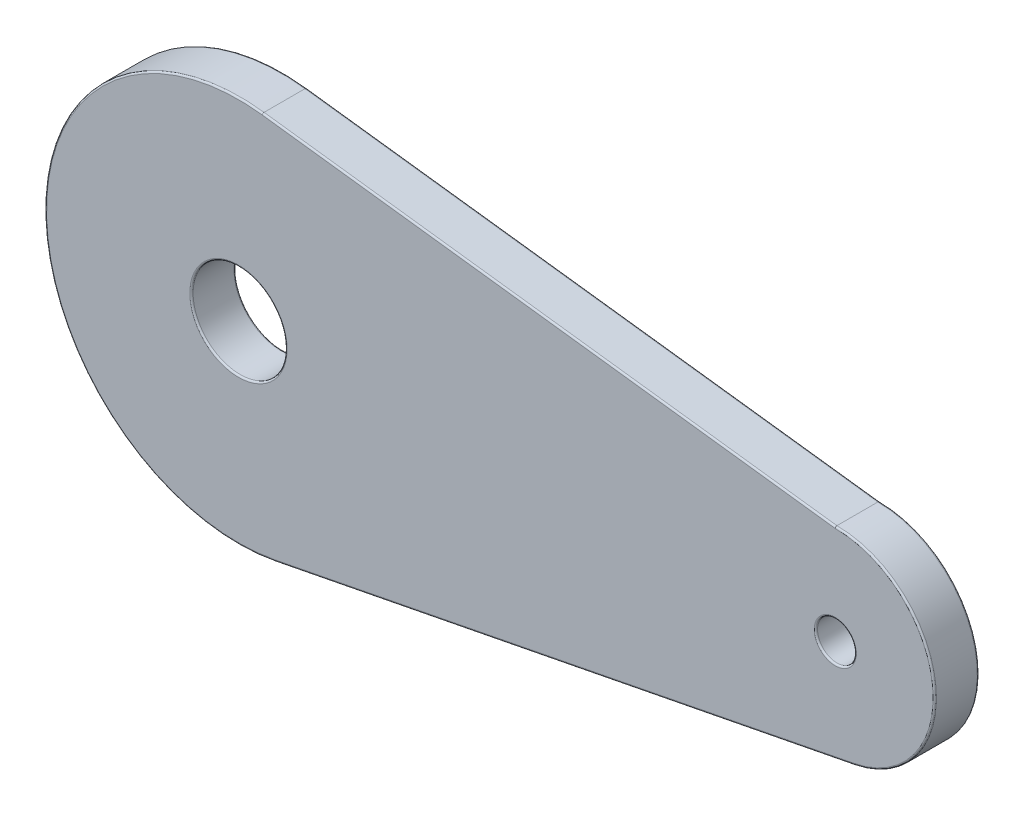
ISO-10303-21;
HEADER;
FILE_DESCRIPTION(('STEP AP214'),'2;1');
FILE_NAME('part.step','',(''),(''),'','','');
FILE_SCHEMA(('AUTOMOTIVE_DESIGN { 1 0 10303 214 1 1 1 1 }'));
ENDSEC;
DATA;
#1=APPLICATION_CONTEXT('core data for automotive mechanical design processes');
#2=APPLICATION_PROTOCOL_DEFINITION('international standard','automotive_design',2000,#1);
#3=PRODUCT_CONTEXT('',#1,'mechanical');
#4=PRODUCT('Part','Part','',(#3));
#5=PRODUCT_RELATED_PRODUCT_CATEGORY('part','',(#4));
#6=PRODUCT_DEFINITION_FORMATION('','',#4);
#7=PRODUCT_DEFINITION_CONTEXT('part definition',#1,'design');
#8=PRODUCT_DEFINITION('design','',#6,#7);
#9=PRODUCT_DEFINITION_SHAPE('','',#8);
#10=(LENGTH_UNIT() NAMED_UNIT(*) SI_UNIT(.MILLI.,.METRE.));
#11=(NAMED_UNIT(*) PLANE_ANGLE_UNIT() SI_UNIT($,.RADIAN.));
#12=(NAMED_UNIT(*) SI_UNIT($,.STERADIAN.) SOLID_ANGLE_UNIT());
#13=UNCERTAINTY_MEASURE_WITH_UNIT(LENGTH_MEASURE(1.E-05),#10,'distance_accuracy_value','');
#14=(GEOMETRIC_REPRESENTATION_CONTEXT(3) GLOBAL_UNCERTAINTY_ASSIGNED_CONTEXT((#13)) GLOBAL_UNIT_ASSIGNED_CONTEXT((#10,
#11,#12)) REPRESENTATION_CONTEXT('',''));
#15=CARTESIAN_POINT('',(0.,0.,0.));
#16=DIRECTION('',(0.,0.,1.));
#17=DIRECTION('',(1.,0.,0.));
#18=AXIS2_PLACEMENT_3D('',#15,#16,#17);
#19=CARTESIAN_POINT('',(-20.22,57.58,-4.));
#20=DIRECTION('',(0.,0.,1.));
#21=DIRECTION('',(1.,0.,0.));
#22=AXIS2_PLACEMENT_3D('',#19,#20,#21);
#23=CYLINDRICAL_SURFACE('',#22,17.5);
#24=DIRECTION('',(0.,0.,1.));
#25=VECTOR('',#24,1.);
#26=CARTESIAN_POINT('',(-18.0510945674369,74.9450755605784,-4.));
#27=LINE('',#26,#25);
#28=CARTESIAN_POINT('',(-18.0510945674369,74.9450755605784,-3.85));
#29=VERTEX_POINT('',#28);
#30=CARTESIAN_POINT('',(-18.0510945674369,74.9450755605784,-0.15));
#31=VERTEX_POINT('',#30);
#32=EDGE_CURVE('E104',#29,#31,#27,.T.);
#33=ORIENTED_EDGE('',*,*,#32,.F.);
#34=CARTESIAN_POINT('',(-20.22,57.58,-3.85));
#35=DIRECTION('',(0.,0.,1.));
#36=DIRECTION('',(1.,0.,0.));
#37=AXIS2_PLACEMENT_3D('',#34,#35,#36);
#38=CIRCLE('',#37,17.5);
#39=CARTESIAN_POINT('',(-16.8604414366495,40.405502445212,-3.85));
#40=VERTEX_POINT('',#39);
#41=EDGE_CURVE('E99',#29,#40,#38,.T.);
#42=ORIENTED_EDGE('',*,*,#41,.T.);
#43=DIRECTION('',(0.,0.,1.));
#44=VECTOR('',#43,1.);
#45=CARTESIAN_POINT('',(-16.8604414366495,40.405502445212,-4.));
#46=LINE('',#45,#44);
#47=CARTESIAN_POINT('',(-16.8604414366495,40.405502445212,-0.15));
#48=VERTEX_POINT('',#47);
#49=EDGE_CURVE('E101',#40,#48,#46,.T.);
#50=ORIENTED_EDGE('',*,*,#49,.T.);
#51=CARTESIAN_POINT('',(-20.22,57.58,-0.15));
#52=DIRECTION('',(0.,0.,1.));
#53=DIRECTION('',(1.,0.,0.));
#54=AXIS2_PLACEMENT_3D('',#51,#52,#53);
#55=CIRCLE('',#54,17.5);
#56=EDGE_CURVE('E110',#48,#31,#55,.F.);
#57=ORIENTED_EDGE('',*,*,#56,.T.);
#58=EDGE_LOOP('',(#33,#42,#50,#57));
#59=FACE_BOUND('',#58,.T.);
#60=ADVANCED_FACE('F33',(#59),#23,.T.);
#61=CARTESIAN_POINT('',(-18.0510945674369,74.9450755605784,-4.));
#62=DIRECTION('',(0.123937453289322,0.992290032033053,0.));
#63=DIRECTION('',(-0.992290032033053,0.123937453289322,0.));
#64=AXIS2_PLACEMENT_3D('',#61,#62,#63);
#65=PLANE('',#64);
#66=DIRECTION('',(0.,0.,1.));
#67=VECTOR('',#66,1.);
#68=CARTESIAN_POINT('',(33.7467217571438,68.4755059448647,-4.));
#69=LINE('',#68,#67);
#70=CARTESIAN_POINT('',(33.7467217571438,68.4755059448647,-3.85));
#71=VERTEX_POINT('',#70);
#72=CARTESIAN_POINT('',(33.7467217571438,68.4755059448647,-0.15));
#73=VERTEX_POINT('',#72);
#74=EDGE_CURVE('E247',#71,#73,#69,.T.);
#75=ORIENTED_EDGE('',*,*,#74,.F.);
#76=DIRECTION('',(-0.992290032033053,0.123937453289322,0.));
#77=VECTOR('',#76,1.);
#78=CARTESIAN_POINT('',(-18.0510945674369,74.9450755605784,-3.85));
#79=LINE('',#78,#77);
#80=EDGE_CURVE('E160',#71,#29,#79,.T.);
#81=ORIENTED_EDGE('',*,*,#80,.T.);
#82=ORIENTED_EDGE('',*,*,#32,.T.);
#83=DIRECTION('',(-0.992290032033053,0.123937453289322,0.));
#84=VECTOR('',#83,1.);
#85=CARTESIAN_POINT('',(-18.0510945674369,74.9450755605784,-0.15));
#86=LINE('',#85,#84);
#87=EDGE_CURVE('E157',#31,#73,#86,.F.);
#88=ORIENTED_EDGE('',*,*,#87,.T.);
#89=EDGE_LOOP('',(#75,#81,#82,#88));
#90=FACE_BOUND('',#89,.T.);
#91=ADVANCED_FACE('F244',(#90),#65,.T.);
#92=CARTESIAN_POINT('',(33.7467217571438,59.4755059448647,-4.));
#93=DIRECTION('',(0.,0.,1.));
#94=DIRECTION('',(1.,0.,0.));
#95=AXIS2_PLACEMENT_3D('',#92,#93,#94);
#96=CYLINDRICAL_SURFACE('',#95,9.);
#97=DIRECTION('',(0.,0.,1.));
#98=VECTOR('',#97,1.);
#99=CARTESIAN_POINT('',(35.4744947325812,50.6429072024023,-4.));
#100=LINE('',#99,#98);
#101=CARTESIAN_POINT('',(35.4744947325812,50.6429072024023,-3.85));
#102=VERTEX_POINT('',#101);
#103=CARTESIAN_POINT('',(35.4744947325812,50.6429072024023,-0.15));
#104=VERTEX_POINT('',#103);
#105=EDGE_CURVE('E121',#102,#104,#100,.T.);
#106=ORIENTED_EDGE('',*,*,#105,.F.);
#107=CARTESIAN_POINT('',(33.7467217571438,59.4755059448647,-3.85));
#108=DIRECTION('',(0.,0.,1.));
#109=DIRECTION('',(1.,0.,0.));
#110=AXIS2_PLACEMENT_3D('',#107,#108,#109);
#111=CIRCLE('',#110,9.);
#112=EDGE_CURVE('E155',#102,#71,#111,.T.);
#113=ORIENTED_EDGE('',*,*,#112,.T.);
#114=ORIENTED_EDGE('',*,*,#74,.T.);
#115=CARTESIAN_POINT('',(33.7467217571438,59.4755059448647,-0.15));
#116=DIRECTION('',(0.,0.,1.));
#117=DIRECTION('',(1.,0.,0.));
#118=AXIS2_PLACEMENT_3D('',#115,#116,#117);
#119=CIRCLE('',#118,9.);
#120=EDGE_CURVE('E153',#73,#104,#119,.F.);
#121=ORIENTED_EDGE('',*,*,#120,.T.);
#122=EDGE_LOOP('',(#106,#113,#114,#121));
#123=FACE_BOUND('',#122,.T.);
#124=ADVANCED_FACE('F277',(#123),#96,.T.);
#125=CARTESIAN_POINT('',(-16.8604414366495,40.405502445212,-4.));
#126=DIRECTION('',(0.191974775048599,-0.981399860273599,0.));
#127=DIRECTION('',(0.981399860273599,0.191974775048599,0.));
#128=AXIS2_PLACEMENT_3D('',#125,#126,#127);
#129=PLANE('',#128);
#130=ORIENTED_EDGE('',*,*,#49,.F.);
#131=DIRECTION('',(0.981399860273599,0.191974775048599,0.));
#132=VECTOR('',#131,1.);
#133=CARTESIAN_POINT('',(35.4744947325813,50.6429072024024,-3.85));
#134=LINE('',#133,#132);
#135=EDGE_CURVE('E117',#40,#102,#134,.T.);
#136=ORIENTED_EDGE('',*,*,#135,.T.);
#137=ORIENTED_EDGE('',*,*,#105,.T.);
#138=DIRECTION('',(0.981399860273599,0.191974775048599,0.));
#139=VECTOR('',#138,1.);
#140=CARTESIAN_POINT('',(-16.8604414366495,40.405502445212,-0.15));
#141=LINE('',#140,#139);
#142=EDGE_CURVE('E120',#104,#48,#141,.F.);
#143=ORIENTED_EDGE('',*,*,#142,.T.);
#144=EDGE_LOOP('',(#130,#136,#137,#143));
#145=FACE_BOUND('',#144,.T.);
#146=ADVANCED_FACE('F114',(#145),#129,.T.);
#147=CARTESIAN_POINT('',(-20.22,57.58,-4.));
#148=DIRECTION('',(0.,0.,1.));
#149=DIRECTION('',(1.,0.,0.));
#150=AXIS2_PLACEMENT_3D('',#147,#148,#149);
#151=PLANE('',#150);
#152=CARTESIAN_POINT('',(33.7467217571438,59.4755059448647,-4.));
#153=DIRECTION('',(0.,0.,1.));
#154=DIRECTION('',(1.,0.,0.));
#155=AXIS2_PLACEMENT_3D('',#152,#153,#154);
#156=CIRCLE('',#155,8.85);
#157=CARTESIAN_POINT('',(33.7374295335089,68.3255010665911,-4.));
#158=VERTEX_POINT('',#157);
#159=CARTESIAN_POINT('',(35.445698516324,50.7901171814434,-4.));
#160=VERTEX_POINT('',#159);
#161=EDGE_CURVE('E149',#158,#160,#156,.F.);
#162=ORIENTED_EDGE('',*,*,#161,.T.);
#163=DIRECTION('',(0.981399860273599,0.191974775048599,0.));
#164=VECTOR('',#163,1.);
#165=CARTESIAN_POINT('',(-16.8892376529068,40.5527124242531,-4.));
#166=LINE('',#165,#164);
#167=CARTESIAN_POINT('',(-16.8892376529068,40.5527124242531,-4.));
#168=VERTEX_POINT('',#167);
#169=EDGE_CURVE('E151',#160,#168,#166,.F.);
#170=ORIENTED_EDGE('',*,*,#169,.T.);
#171=CARTESIAN_POINT('',(-20.22,57.58,-4.));
#172=DIRECTION('',(0.,0.,1.));
#173=DIRECTION('',(1.,0.,0.));
#174=AXIS2_PLACEMENT_3D('',#171,#172,#173);
#175=CIRCLE('',#174,17.35);
#176=CARTESIAN_POINT('',(-18.0696851854303,74.7962320557735,-4.));
#177=VERTEX_POINT('',#176);
#178=EDGE_CURVE('E127',#168,#177,#175,.F.);
#179=ORIENTED_EDGE('',*,*,#178,.T.);
#180=DIRECTION('',(-0.992290032033053,0.123937453289322,0.));
#181=VECTOR('',#180,1.);
#182=CARTESIAN_POINT('',(33.7281311391504,68.3266624400598,-4.));
#183=LINE('',#182,#181);
#184=EDGE_CURVE('E147',#177,#158,#183,.F.);
#185=ORIENTED_EDGE('',*,*,#184,.T.);
#186=EDGE_LOOP('',(#162,#170,#179,#185));
#187=FACE_BOUND('',#186,.T.);
#188=CARTESIAN_POINT('',(-20.22,57.58,-4.));
#189=DIRECTION('',(0.,0.,1.));
#190=DIRECTION('',(1.,0.,0.));
#191=AXIS2_PLACEMENT_3D('',#188,#189,#190);
#192=CIRCLE('',#191,4.4);
#193=CARTESIAN_POINT('',(-15.82,57.58,-4.));
#194=VERTEX_POINT('',#193);
#195=EDGE_CURVE('E140',#194,#194,#192,.T.);
#196=ORIENTED_EDGE('',*,*,#195,.T.);
#197=EDGE_LOOP('',(#196));
#198=FACE_BOUND('',#197,.T.);
#199=CARTESIAN_POINT('',(33.7467217571438,59.4755059448647,-4.));
#200=DIRECTION('',(0.,0.,1.));
#201=DIRECTION('',(1.,0.,0.));
#202=AXIS2_PLACEMENT_3D('',#199,#200,#201);
#203=CIRCLE('',#202,1.9);
#204=CARTESIAN_POINT('',(35.6467217571438,59.4755059448647,-4.));
#205=VERTEX_POINT('',#204);
#206=EDGE_CURVE('E137',#205,#205,#203,.T.);
#207=ORIENTED_EDGE('',*,*,#206,.T.);
#208=EDGE_LOOP('',(#207));
#209=FACE_BOUND('',#208,.T.);
#210=ADVANCED_FACE('F254',(#187,#198,#209),#151,.F.);
#211=CARTESIAN_POINT('',(-20.22,57.58,0.));
#212=DIRECTION('',(0.,0.,1.));
#213=DIRECTION('',(1.,0.,0.));
#214=AXIS2_PLACEMENT_3D('',#211,#212,#213);
#215=PLANE('',#214);
#216=CARTESIAN_POINT('',(33.7467217571438,59.4755059448647,0.));
#217=DIRECTION('',(0.,0.,1.));
#218=DIRECTION('',(1.,0.,0.));
#219=AXIS2_PLACEMENT_3D('',#216,#217,#218);
#220=CIRCLE('',#219,8.85);
#221=CARTESIAN_POINT('',(35.445698516324,50.7901171814434,0.));
#222=VERTEX_POINT('',#221);
#223=CARTESIAN_POINT('',(33.7374295335089,68.3255010665911,0.));
#224=VERTEX_POINT('',#223);
#225=EDGE_CURVE('E42',#222,#224,#220,.T.);
#226=ORIENTED_EDGE('',*,*,#225,.T.);
#227=DIRECTION('',(-0.992290032033053,0.123937453289322,0.));
#228=VECTOR('',#227,1.);
#229=CARTESIAN_POINT('',(-18.0696851854303,74.7962320557735,0.));
#230=LINE('',#229,#228);
#231=CARTESIAN_POINT('',(-18.0696851854303,74.7962320557735,0.));
#232=VERTEX_POINT('',#231);
#233=EDGE_CURVE('E11',#224,#232,#230,.T.);
#234=ORIENTED_EDGE('',*,*,#233,.T.);
#235=CARTESIAN_POINT('',(-20.22,57.58,0.));
#236=DIRECTION('',(0.,0.,1.));
#237=DIRECTION('',(1.,0.,0.));
#238=AXIS2_PLACEMENT_3D('',#235,#236,#237);
#239=CIRCLE('',#238,17.35);
#240=CARTESIAN_POINT('',(-16.8892376529068,40.5527124242531,0.));
#241=VERTEX_POINT('',#240);
#242=EDGE_CURVE('E180',#232,#241,#239,.T.);
#243=ORIENTED_EDGE('',*,*,#242,.T.);
#244=DIRECTION('',(0.981399860273599,0.191974775048599,0.));
#245=VECTOR('',#244,1.);
#246=CARTESIAN_POINT('',(-16.8892376529068,40.5527124242531,0.));
#247=LINE('',#246,#245);
#248=EDGE_CURVE('E53',#241,#222,#247,.T.);
#249=ORIENTED_EDGE('',*,*,#248,.T.);
#250=EDGE_LOOP('',(#226,#234,#243,#249));
#251=FACE_BOUND('',#250,.T.);
#252=CARTESIAN_POINT('',(-20.22,57.58,0.));
#253=DIRECTION('',(0.,0.,1.));
#254=DIRECTION('',(1.,0.,0.));
#255=AXIS2_PLACEMENT_3D('',#252,#253,#254);
#256=CIRCLE('',#255,4.4);
#257=CARTESIAN_POINT('',(-15.82,57.58,0.));
#258=VERTEX_POINT('',#257);
#259=EDGE_CURVE('E177',#258,#258,#256,.F.);
#260=ORIENTED_EDGE('',*,*,#259,.T.);
#261=EDGE_LOOP('',(#260));
#262=FACE_BOUND('',#261,.T.);
#263=CARTESIAN_POINT('',(33.7467217571438,59.4755059448647,0.));
#264=DIRECTION('',(0.,0.,1.));
#265=DIRECTION('',(1.,0.,0.));
#266=AXIS2_PLACEMENT_3D('',#263,#264,#265);
#267=CIRCLE('',#266,1.9);
#268=CARTESIAN_POINT('',(35.6467217571438,59.4755059448647,0.));
#269=VERTEX_POINT('',#268);
#270=EDGE_CURVE('E174',#269,#269,#267,.F.);
#271=ORIENTED_EDGE('',*,*,#270,.T.);
#272=EDGE_LOOP('',(#271));
#273=FACE_BOUND('',#272,.T.);
#274=ADVANCED_FACE('F250',(#251,#262,#273),#215,.T.);
#275=CARTESIAN_POINT('',(-20.22,57.58,-4.));
#276=DIRECTION('',(0.,0.,1.));
#277=DIRECTION('',(1.,0.,0.));
#278=AXIS2_PLACEMENT_3D('',#275,#276,#277);
#279=CYLINDRICAL_SURFACE('',#278,4.25);
#280=CARTESIAN_POINT('',(-20.22,57.58,-3.85));
#281=DIRECTION('',(0.,0.,1.));
#282=DIRECTION('',(1.,0.,0.));
#283=AXIS2_PLACEMENT_3D('',#280,#281,#282);
#284=CIRCLE('',#283,4.25);
#285=CARTESIAN_POINT('',(-15.97,57.58,-3.85));
#286=VERTEX_POINT('',#285);
#287=EDGE_CURVE('E165',#286,#286,#284,.F.);
#288=ORIENTED_EDGE('',*,*,#287,.T.);
#289=EDGE_LOOP('',(#288));
#290=FACE_BOUND('',#289,.T.);
#291=CARTESIAN_POINT('',(-20.22,57.58,-0.15));
#292=DIRECTION('',(0.,0.,1.));
#293=DIRECTION('',(1.,0.,0.));
#294=AXIS2_PLACEMENT_3D('',#291,#292,#293);
#295=CIRCLE('',#294,4.25);
#296=CARTESIAN_POINT('',(-15.97,57.58,-0.15));
#297=VERTEX_POINT('',#296);
#298=EDGE_CURVE('E109',#297,#297,#295,.T.);
#299=ORIENTED_EDGE('',*,*,#298,.T.);
#300=EDGE_LOOP('',(#299));
#301=FACE_BOUND('',#300,.T.);
#302=ADVANCED_FACE('F253',(#290,#301),#279,.F.);
#303=CARTESIAN_POINT('',(33.7467217571438,59.4755059448647,-4.));
#304=DIRECTION('',(0.,0.,1.));
#305=DIRECTION('',(1.,0.,0.));
#306=AXIS2_PLACEMENT_3D('',#303,#304,#305);
#307=CYLINDRICAL_SURFACE('',#306,1.75);
#308=CARTESIAN_POINT('',(33.7467217571438,59.4755059448647,-3.85));
#309=DIRECTION('',(0.,0.,1.));
#310=DIRECTION('',(1.,0.,0.));
#311=AXIS2_PLACEMENT_3D('',#308,#309,#310);
#312=CIRCLE('',#311,1.75);
#313=CARTESIAN_POINT('',(35.4967217571438,59.4755059448647,-3.85));
#314=VERTEX_POINT('',#313);
#315=EDGE_CURVE('E171',#314,#314,#312,.F.);
#316=ORIENTED_EDGE('',*,*,#315,.T.);
#317=EDGE_LOOP('',(#316));
#318=FACE_BOUND('',#317,.T.);
#319=CARTESIAN_POINT('',(33.7467217571438,59.4755059448647,-0.15));
#320=DIRECTION('',(0.,0.,1.));
#321=DIRECTION('',(1.,0.,0.));
#322=AXIS2_PLACEMENT_3D('',#319,#320,#321);
#323=CIRCLE('',#322,1.75);
#324=CARTESIAN_POINT('',(35.4967217571438,59.4755059448647,-0.15));
#325=VERTEX_POINT('',#324);
#326=EDGE_CURVE('E168',#325,#325,#323,.T.);
#327=ORIENTED_EDGE('',*,*,#326,.T.);
#328=EDGE_LOOP('',(#327));
#329=FACE_BOUND('',#328,.T.);
#330=ADVANCED_FACE('F201',(#318,#329),#307,.F.);
#331=CARTESIAN_POINT('',(-18.0696851854303,74.7962320557735,-3.85));
#332=DIRECTION('',(0.992290032033053,-0.123937453289322,0.));
#333=DIRECTION('',(0.123937453289322,0.992290032033053,0.));
#334=AXIS2_PLACEMENT_3D('',#331,#332,#333);
#335=CYLINDRICAL_SURFACE('',#334,0.15);
#336=CARTESIAN_POINT('',(33.7467217571438,68.4755059448647,-3.85));
#337=CARTESIAN_POINT('',(33.7467222168358,68.4755131656087,-3.85842659701889));
#338=CARTESIAN_POINT('',(33.7466776116465,68.4747963048347,-3.86685095839555));
#339=CARTESIAN_POINT('',(33.7465016638026,68.4719677037149,-3.88345494589551));
#340=CARTESIAN_POINT('',(33.746370387366,68.4698570282625,-3.8916347538778));
#341=CARTESIAN_POINT('',(33.746024399664,68.4642926428983,-3.90752662756495));
#342=CARTESIAN_POINT('',(33.7458096497533,68.4608383109193,-3.91523847470544));
#343=CARTESIAN_POINT('',(33.7453032126542,68.452688823793,-3.92997057043136));
#344=CARTESIAN_POINT('',(33.7450115439834,68.447993967291,-3.93699098491554));
#345=CARTESIAN_POINT('',(33.7443594566485,68.4374924415232,-3.95014929169074));
#346=CARTESIAN_POINT('',(33.7439989853661,68.4316849213103,-3.95628650219016));
#347=CARTESIAN_POINT('',(33.7432197112298,68.4191228659071,-3.96750171653171));
#348=CARTESIAN_POINT('',(33.742800883773,68.4123679312801,-3.97257927135741));
#349=CARTESIAN_POINT('',(33.7419161747661,68.3980899820784,-3.98153937462097));
#350=CARTESIAN_POINT('',(33.7414501898195,68.3905652793143,-3.98541921815318));
#351=CARTESIAN_POINT('',(33.7404856023918,68.3749783157473,-3.99185616378377));
#352=CARTESIAN_POINT('',(33.7399870407054,68.3669167270343,-3.99441488582548));
#353=CARTESIAN_POINT('',(33.7392125828832,68.354384928688,-3.99726010562137));
#354=CARTESIAN_POINT('',(33.7389430671238,68.3500221761692,-3.99804880981438));
#355=CARTESIAN_POINT('',(33.7384012239858,68.3412478154734,-3.99923673832497));
#356=CARTESIAN_POINT('',(33.7381289003219,68.3368362713967,-3.99963642359302));
#357=CARTESIAN_POINT('',(33.7377140190477,68.3301127746362,-3.99994690889627));
#358=CARTESIAN_POINT('',(33.7375717464837,68.3278066705139,-4.00000014900632));
#359=CARTESIAN_POINT('',(33.7374295335089,68.3255010665911,-4.));
#360=B_SPLINE_CURVE_WITH_KNOTS('',3,(#336,#337,#338,#339,#340,#341,#342,#343,#344,#345,#346,
#347,#348,#349,#350,#351,#352,#353,#354,#355,#356,#357,#358,#359),.UNSPECIFIED.,.F.,.F.,(4,2,2,
2,2,2,2,2,2,2,2,4),(0.,0.0252460157420335,0.0504727654646435,0.0757112082387176,
0.100943580604456,0.126195327866208,0.151457753625355,0.176776821449772,0.202064769163378,
0.215375442031728,0.228670323747252,0.235600937087799),.UNSPECIFIED.);
#361=EDGE_CURVE('E131',#158,#71,#360,.F.);
#362=ORIENTED_EDGE('',*,*,#361,.F.);
#363=ORIENTED_EDGE('',*,*,#184,.F.);
#364=CARTESIAN_POINT('',(-18.0696851854303,74.7962320557735,-3.85));
#365=DIRECTION('',(-0.992290032033053,0.123937453289323,0.));
#366=DIRECTION('',(-0.123937453289323,-0.992290032033053,0.));
#367=AXIS2_PLACEMENT_3D('',#364,#365,#366);
#368=CIRCLE('',#367,0.15);
#369=EDGE_CURVE('E122',#29,#177,#368,.T.);
#370=ORIENTED_EDGE('',*,*,#369,.F.);
#371=ORIENTED_EDGE('',*,*,#80,.F.);
#372=EDGE_LOOP('',(#362,#363,#370,#371));
#373=FACE_BOUND('',#372,.T.);
#374=ADVANCED_FACE('F197',(#373),#335,.T.);
#375=CARTESIAN_POINT('',(-20.22,57.58,-3.85));
#376=DIRECTION('',(0.,0.,1.));
#377=DIRECTION('',(1.,0.,0.));
#378=AXIS2_PLACEMENT_3D('',#375,#376,#377);
#379=TOROIDAL_SURFACE('',#378,17.35,0.15);
#380=ORIENTED_EDGE('',*,*,#369,.T.);
#381=ORIENTED_EDGE('',*,*,#178,.F.);
#382=CARTESIAN_POINT('',(-16.8892376529068,40.5527124242531,-3.85));
#383=DIRECTION('',(0.981399860273597,0.191974775048608,0.));
#384=DIRECTION('',(-0.191974775048608,0.981399860273597,0.));
#385=AXIS2_PLACEMENT_3D('',#382,#383,#384);
#386=CIRCLE('',#385,0.15);
#387=EDGE_CURVE('E125',#40,#168,#386,.T.);
#388=ORIENTED_EDGE('',*,*,#387,.F.);
#389=ORIENTED_EDGE('',*,*,#41,.F.);
#390=EDGE_LOOP('',(#380,#381,#388,#389));
#391=FACE_BOUND('',#390,.T.);
#392=ADVANCED_FACE('F126',(#391),#379,.T.);
#393=CARTESIAN_POINT('',(33.7467217571438,59.4755059448647,-3.85));
#394=DIRECTION('',(0.,0.,1.));
#395=DIRECTION('',(1.,0.,0.));
#396=AXIS2_PLACEMENT_3D('',#393,#394,#395);
#397=TOROIDAL_SURFACE('',#396,8.85,0.15);
#398=ORIENTED_EDGE('',*,*,#361,.T.);
#399=ORIENTED_EDGE('',*,*,#112,.F.);
#400=CARTESIAN_POINT('',(35.445698516324,50.7901171814434,-3.85));
#401=DIRECTION('',(-0.981399860273602,-0.191974775048586,0.));
#402=DIRECTION('',(0.191974775048586,-0.981399860273602,0.));
#403=AXIS2_PLACEMENT_3D('',#400,#401,#402);
#404=CIRCLE('',#403,0.15);
#405=EDGE_CURVE('E132',#160,#102,#404,.T.);
#406=ORIENTED_EDGE('',*,*,#405,.F.);
#407=ORIENTED_EDGE('',*,*,#161,.F.);
#408=EDGE_LOOP('',(#398,#399,#406,#407));
#409=FACE_BOUND('',#408,.T.);
#410=ADVANCED_FACE('F194',(#409),#397,.T.);
#411=CARTESIAN_POINT('',(-16.8892376529068,40.5527124242531,-3.85));
#412=DIRECTION('',(-0.981399860273599,-0.191974775048599,0.));
#413=DIRECTION('',(0.191974775048599,-0.981399860273599,0.));
#414=AXIS2_PLACEMENT_3D('',#411,#412,#413);
#415=CYLINDRICAL_SURFACE('',#414,0.15);
#416=ORIENTED_EDGE('',*,*,#387,.T.);
#417=ORIENTED_EDGE('',*,*,#169,.F.);
#418=ORIENTED_EDGE('',*,*,#405,.T.);
#419=ORIENTED_EDGE('',*,*,#135,.F.);
#420=EDGE_LOOP('',(#416,#417,#418,#419));
#421=FACE_BOUND('',#420,.T.);
#422=ADVANCED_FACE('F134',(#421),#415,.T.);
#423=CARTESIAN_POINT('',(-20.22,57.58,-3.85));
#424=DIRECTION('',(0.,0.,1.));
#425=DIRECTION('',(1.,0.,0.));
#426=AXIS2_PLACEMENT_3D('',#423,#424,#425);
#427=TOROIDAL_SURFACE('',#426,4.4,0.15);
#428=ORIENTED_EDGE('',*,*,#287,.F.);
#429=EDGE_LOOP('',(#428));
#430=FACE_BOUND('',#429,.T.);
#431=ORIENTED_EDGE('',*,*,#195,.F.);
#432=EDGE_LOOP('',(#431));
#433=FACE_BOUND('',#432,.T.);
#434=ADVANCED_FACE('F205',(#430,#433),#427,.T.);
#435=CARTESIAN_POINT('',(33.7467217571438,59.4755059448647,-3.85));
#436=DIRECTION('',(0.,0.,1.));
#437=DIRECTION('',(1.,0.,0.));
#438=AXIS2_PLACEMENT_3D('',#435,#436,#437);
#439=TOROIDAL_SURFACE('',#438,1.9,0.15);
#440=ORIENTED_EDGE('',*,*,#315,.F.);
#441=EDGE_LOOP('',(#440));
#442=FACE_BOUND('',#441,.T.);
#443=ORIENTED_EDGE('',*,*,#206,.F.);
#444=EDGE_LOOP('',(#443));
#445=FACE_BOUND('',#444,.T.);
#446=ADVANCED_FACE('F208',(#442,#445),#439,.T.);
#447=CARTESIAN_POINT('',(-16.8892376529068,40.5527124242531,-0.15));
#448=DIRECTION('',(0.981399860273599,0.191974775048599,0.));
#449=DIRECTION('',(-0.191974775048599,0.981399860273599,0.));
#450=AXIS2_PLACEMENT_3D('',#447,#448,#449);
#451=CYLINDRICAL_SURFACE('',#450,0.15);
#452=CARTESIAN_POINT('',(-16.8892376529068,40.5527124242531,-0.15));
#453=DIRECTION('',(-0.981399860273597,-0.191974775048608,0.));
#454=DIRECTION('',(0.191974775048608,-0.981399860273597,0.));
#455=AXIS2_PLACEMENT_3D('',#452,#453,#454);
#456=CIRCLE('',#455,0.15);
#457=EDGE_CURVE('E230',#48,#241,#456,.T.);
#458=ORIENTED_EDGE('',*,*,#457,.F.);
#459=ORIENTED_EDGE('',*,*,#142,.F.);
#460=CARTESIAN_POINT('',(35.445698516324,50.7901171814434,-0.15));
#461=DIRECTION('',(0.981399860273603,0.191974775048577,0.));
#462=DIRECTION('',(-0.191974775048577,0.981399860273603,0.));
#463=AXIS2_PLACEMENT_3D('',#460,#461,#462);
#464=CIRCLE('',#463,0.15);
#465=EDGE_CURVE('E37',#222,#104,#464,.T.);
#466=ORIENTED_EDGE('',*,*,#465,.F.);
#467=ORIENTED_EDGE('',*,*,#248,.F.);
#468=EDGE_LOOP('',(#458,#459,#466,#467));
#469=FACE_BOUND('',#468,.T.);
#470=ADVANCED_FACE('F212',(#469),#451,.T.);
#471=CARTESIAN_POINT('',(33.7467217571438,59.4755059448647,-0.15));
#472=DIRECTION('',(0.,0.,1.));
#473=DIRECTION('',(1.,0.,0.));
#474=AXIS2_PLACEMENT_3D('',#471,#472,#473);
#475=TOROIDAL_SURFACE('',#474,8.85,0.15);
#476=ORIENTED_EDGE('',*,*,#465,.T.);
#477=ORIENTED_EDGE('',*,*,#120,.F.);
#478=CARTESIAN_POINT('',(33.7467217571438,68.4755059448647,-0.15));
#479=CARTESIAN_POINT('',(33.7467222168358,68.4755131656087,-0.141573402981107));
#480=CARTESIAN_POINT('',(33.7466776116465,68.4747963048347,-0.13314904160445));
#481=CARTESIAN_POINT('',(33.7465016638026,68.4719677037149,-0.11654505410449));
#482=CARTESIAN_POINT('',(33.746370387366,68.4698570282625,-0.108365246122195));
#483=CARTESIAN_POINT('',(33.746024399664,68.4642926428983,-0.0924733724350448));
#484=CARTESIAN_POINT('',(33.7458096497533,68.4608383109193,-0.0847615252945565));
#485=CARTESIAN_POINT('',(33.7453032126542,68.452688823793,-0.0700294295686356));
#486=CARTESIAN_POINT('',(33.7450115439834,68.447993967291,-0.0630090150844648));
#487=CARTESIAN_POINT('',(33.7443594566485,68.4374924415232,-0.0498507083092554));
#488=CARTESIAN_POINT('',(33.7439989853661,68.4316849213103,-0.0437134978098247));
#489=CARTESIAN_POINT('',(33.7432197112298,68.419122865907,-0.0324982834682725));
#490=CARTESIAN_POINT('',(33.742800883773,68.4123679312801,-0.0274207286425855));
#491=CARTESIAN_POINT('',(33.7419161747661,68.3980899820784,-0.018460625379034));
#492=CARTESIAN_POINT('',(33.7414501898195,68.3905652793143,-0.0145807818468279));
#493=CARTESIAN_POINT('',(33.7404856023918,68.3749783157473,-0.00814383621623182));
#494=CARTESIAN_POINT('',(33.7399870407054,68.3669167270343,-0.00558511417451856));
#495=CARTESIAN_POINT('',(33.7392125828832,68.354384928688,-0.00273989437862779));
#496=CARTESIAN_POINT('',(33.7389430671238,68.3500221761692,-0.00195119018562702));
#497=CARTESIAN_POINT('',(33.7384012239858,68.3412478154734,-0.000763261675033746));
#498=CARTESIAN_POINT('',(33.7381289003219,68.3368362713967,-0.000363576406985109));
#499=CARTESIAN_POINT('',(33.7377140190477,68.3301127746362,-5.30911037310661E-05));
#500=CARTESIAN_POINT('',(33.7375717464837,68.3278066705139,1.49006321583264E-07));
#501=CARTESIAN_POINT('',(33.7374295335089,68.3255010665911,0.));
#502=B_SPLINE_CURVE_WITH_KNOTS('',3,(#478,#479,#480,#481,#482,#483,#484,#485,#486,#487,#488,
#489,#490,#491,#492,#493,#494,#495,#496,#497,#498,#499,#500,#501),.UNSPECIFIED.,.F.,.F.,(4,2,2,
2,2,2,2,2,2,2,2,4),(0.,0.0252460157420334,0.0504727654646439,0.0757112082387181,
0.100943580604456,0.126195327866233,0.151457753625356,0.176776821449758,0.20206476916338,
0.215375442031701,0.228670323747242,0.2356009370878),.UNSPECIFIED.);
#503=EDGE_CURVE('E225',#224,#73,#502,.F.);
#504=ORIENTED_EDGE('',*,*,#503,.F.);
#505=ORIENTED_EDGE('',*,*,#225,.F.);
#506=EDGE_LOOP('',(#476,#477,#504,#505));
#507=FACE_BOUND('',#506,.T.);
#508=ADVANCED_FACE('F221',(#507),#475,.T.);
#509=CARTESIAN_POINT('',(-20.22,57.58,-0.15));
#510=DIRECTION('',(0.,0.,1.));
#511=DIRECTION('',(1.,0.,0.));
#512=AXIS2_PLACEMENT_3D('',#509,#510,#511);
#513=TOROIDAL_SURFACE('',#512,17.35,0.15);
#514=ORIENTED_EDGE('',*,*,#457,.T.);
#515=ORIENTED_EDGE('',*,*,#242,.F.);
#516=CARTESIAN_POINT('',(-18.0696851854303,74.7962320557735,-0.15));
#517=DIRECTION('',(0.992290032033053,-0.123937453289323,0.));
#518=DIRECTION('',(0.123937453289323,0.992290032033053,0.));
#519=AXIS2_PLACEMENT_3D('',#516,#517,#518);
#520=CIRCLE('',#519,0.15);
#521=EDGE_CURVE('E231',#31,#232,#520,.T.);
#522=ORIENTED_EDGE('',*,*,#521,.F.);
#523=ORIENTED_EDGE('',*,*,#56,.F.);
#524=EDGE_LOOP('',(#514,#515,#522,#523));
#525=FACE_BOUND('',#524,.T.);
#526=ADVANCED_FACE('F219',(#525),#513,.T.);
#527=CARTESIAN_POINT('',(-18.0696851854303,74.7962320557735,-0.15));
#528=DIRECTION('',(-0.992290032033053,0.123937453289322,0.));
#529=DIRECTION('',(-0.123937453289322,-0.992290032033053,0.));
#530=AXIS2_PLACEMENT_3D('',#527,#528,#529);
#531=CYLINDRICAL_SURFACE('',#530,0.15);
#532=ORIENTED_EDGE('',*,*,#503,.T.);
#533=ORIENTED_EDGE('',*,*,#87,.F.);
#534=ORIENTED_EDGE('',*,*,#521,.T.);
#535=ORIENTED_EDGE('',*,*,#233,.F.);
#536=EDGE_LOOP('',(#532,#533,#534,#535));
#537=FACE_BOUND('',#536,.T.);
#538=ADVANCED_FACE('F214',(#537),#531,.T.);
#539=CARTESIAN_POINT('',(-20.22,57.58,-0.15));
#540=DIRECTION('',(0.,0.,1.));
#541=DIRECTION('',(1.,0.,0.));
#542=AXIS2_PLACEMENT_3D('',#539,#540,#541);
#543=TOROIDAL_SURFACE('',#542,4.4,0.15);
#544=ORIENTED_EDGE('',*,*,#259,.F.);
#545=EDGE_LOOP('',(#544));
#546=FACE_BOUND('',#545,.T.);
#547=ORIENTED_EDGE('',*,*,#298,.F.);
#548=EDGE_LOOP('',(#547));
#549=FACE_BOUND('',#548,.T.);
#550=ADVANCED_FACE('F218',(#546,#549),#543,.T.);
#551=CARTESIAN_POINT('',(33.7467217571438,59.4755059448647,-0.15));
#552=DIRECTION('',(0.,0.,1.));
#553=DIRECTION('',(1.,0.,0.));
#554=AXIS2_PLACEMENT_3D('',#551,#552,#553);
#555=TOROIDAL_SURFACE('',#554,1.9,0.15);
#556=ORIENTED_EDGE('',*,*,#270,.F.);
#557=EDGE_LOOP('',(#556));
#558=FACE_BOUND('',#557,.T.);
#559=ORIENTED_EDGE('',*,*,#326,.F.);
#560=EDGE_LOOP('',(#559));
#561=FACE_BOUND('',#560,.T.);
#562=ADVANCED_FACE('F35',(#558,#561),#555,.T.);
#563=CLOSED_SHELL('',(#60,#91,#124,#146,#210,#274,#302,#330,#374,#392,#410,#422,#434,#446,#470,
#508,#526,#538,#550,#562));
#564=MANIFOLD_SOLID_BREP('B2',#563);
#565=ADVANCED_BREP_SHAPE_REPRESENTATION('',(#18,#564),#14);
#566=SHAPE_DEFINITION_REPRESENTATION(#9,#565);
ENDSEC;
END-ISO-10303-21;
